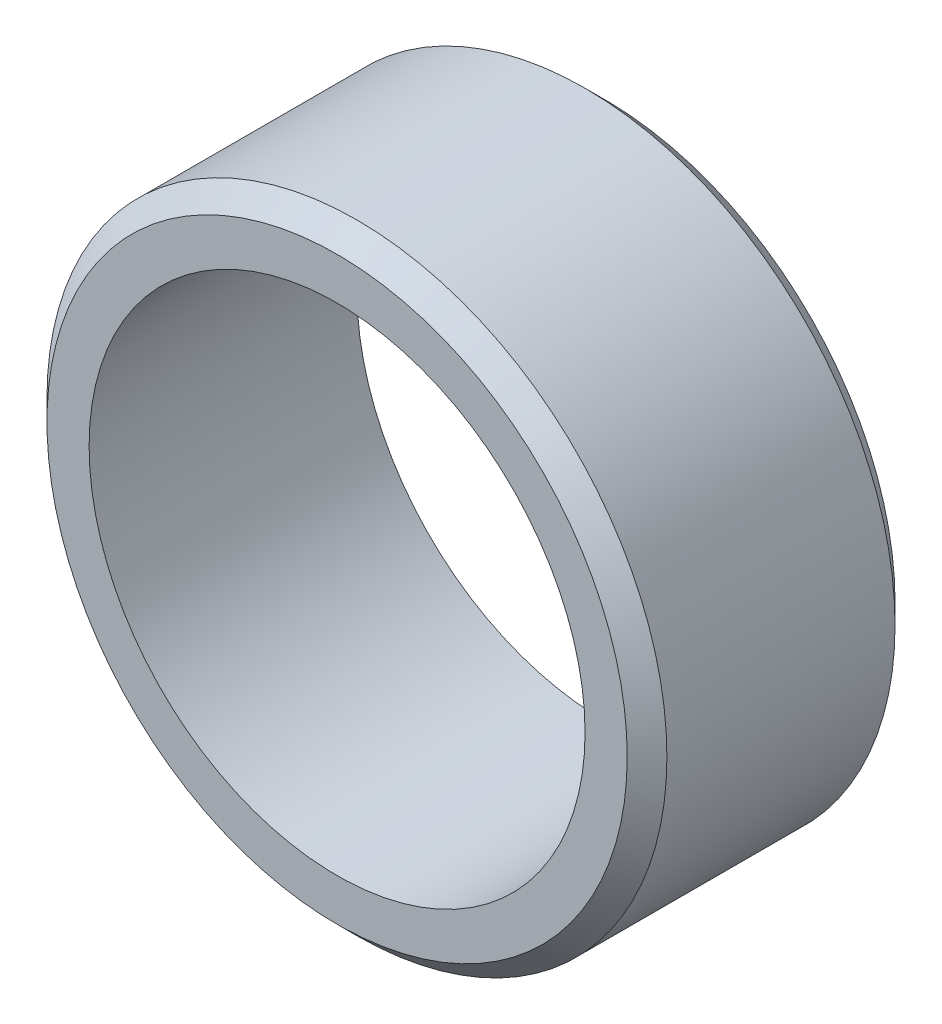
ISO-10303-21;
HEADER;
FILE_DESCRIPTION(('STEP AP214'),'2;1');
FILE_NAME('part.step','',(''),(''),'','','');
FILE_SCHEMA(('AUTOMOTIVE_DESIGN { 1 0 10303 214 1 1 1 1 }'));
ENDSEC;
DATA;
#1=APPLICATION_CONTEXT('core data for automotive mechanical design processes');
#2=APPLICATION_PROTOCOL_DEFINITION('international standard','automotive_design',2000,#1);
#3=PRODUCT_CONTEXT('',#1,'mechanical');
#4=PRODUCT('Part','Part','',(#3));
#5=PRODUCT_RELATED_PRODUCT_CATEGORY('part','',(#4));
#6=PRODUCT_DEFINITION_FORMATION('','',#4);
#7=PRODUCT_DEFINITION_CONTEXT('part definition',#1,'design');
#8=PRODUCT_DEFINITION('design','',#6,#7);
#9=PRODUCT_DEFINITION_SHAPE('','',#8);
#10=(LENGTH_UNIT() NAMED_UNIT(*) SI_UNIT(.MILLI.,.METRE.));
#11=(NAMED_UNIT(*) PLANE_ANGLE_UNIT() SI_UNIT($,.RADIAN.));
#12=(NAMED_UNIT(*) SI_UNIT($,.STERADIAN.) SOLID_ANGLE_UNIT());
#13=UNCERTAINTY_MEASURE_WITH_UNIT(LENGTH_MEASURE(1.E-05),#10,'distance_accuracy_value','');
#14=(GEOMETRIC_REPRESENTATION_CONTEXT(3) GLOBAL_UNCERTAINTY_ASSIGNED_CONTEXT((#13)) GLOBAL_UNIT_ASSIGNED_CONTEXT((#10,
#11,#12)) REPRESENTATION_CONTEXT('',''));
#15=CARTESIAN_POINT('',(0.,0.,0.));
#16=DIRECTION('',(0.,0.,1.));
#17=DIRECTION('',(1.,0.,0.));
#18=AXIS2_PLACEMENT_3D('',#15,#16,#17);
#19=CARTESIAN_POINT('',(0.,0.,6.858));
#20=DIRECTION('',(0.,0.,1.));
#21=DIRECTION('',(1.,0.,0.));
#22=AXIS2_PLACEMENT_3D('',#19,#20,#21);
#23=PLANE('',#22);
#24=CARTESIAN_POINT('',(0.,0.,6.858));
#25=DIRECTION('',(0.,0.,1.));
#26=DIRECTION('',(1.,0.,0.));
#27=AXIS2_PLACEMENT_3D('',#24,#25,#26);
#28=CIRCLE('',#27,7.42950000000001);
#29=CARTESIAN_POINT('',(7.42950000000001,0.,6.858));
#30=VERTEX_POINT('',#29);
#31=EDGE_CURVE('E10',#30,#30,#28,.T.);
#32=ORIENTED_EDGE('',*,*,#31,.T.);
#33=EDGE_LOOP('',(#32));
#34=FACE_BOUND('',#33,.T.);
#35=CARTESIAN_POINT('',(0.,0.,6.858));
#36=DIRECTION('',(0.,0.,1.));
#37=DIRECTION('',(1.,0.,0.));
#38=AXIS2_PLACEMENT_3D('',#35,#36,#37);
#39=CIRCLE('',#38,6.35);
#40=CARTESIAN_POINT('',(6.35,0.,6.858));
#41=VERTEX_POINT('',#40);
#42=EDGE_CURVE('E50',#41,#41,#39,.T.);
#43=ORIENTED_EDGE('',*,*,#42,.F.);
#44=EDGE_LOOP('',(#43));
#45=FACE_BOUND('',#44,.T.);
#46=ADVANCED_FACE('F30',(#34,#45),#23,.T.);
#47=CARTESIAN_POINT('',(0.,0.,0.));
#48=DIRECTION('',(0.,0.,1.));
#49=DIRECTION('',(1.,0.,0.));
#50=AXIS2_PLACEMENT_3D('',#47,#48,#49);
#51=PLANE('',#50);
#52=CARTESIAN_POINT('',(0.,0.,0.));
#53=DIRECTION('',(0.,0.,1.));
#54=DIRECTION('',(1.,0.,0.));
#55=AXIS2_PLACEMENT_3D('',#52,#53,#54);
#56=CIRCLE('',#55,7.4295);
#57=CARTESIAN_POINT('',(7.4295,0.,0.));
#58=VERTEX_POINT('',#57);
#59=EDGE_CURVE('E37',#58,#58,#56,.F.);
#60=ORIENTED_EDGE('',*,*,#59,.T.);
#61=EDGE_LOOP('',(#60));
#62=FACE_BOUND('',#61,.T.);
#63=CARTESIAN_POINT('',(0.,0.,0.));
#64=DIRECTION('',(0.,0.,1.));
#65=DIRECTION('',(1.,0.,0.));
#66=AXIS2_PLACEMENT_3D('',#63,#64,#65);
#67=CIRCLE('',#66,6.35);
#68=CARTESIAN_POINT('',(6.35,0.,0.));
#69=VERTEX_POINT('',#68);
#70=EDGE_CURVE('E51',#69,#69,#67,.T.);
#71=ORIENTED_EDGE('',*,*,#70,.T.);
#72=EDGE_LOOP('',(#71));
#73=FACE_BOUND('',#72,.T.);
#74=ADVANCED_FACE('F61',(#62,#73),#51,.F.);
#75=CARTESIAN_POINT('',(0.,0.,6.858));
#76=DIRECTION('',(0.,0.,-1.));
#77=DIRECTION('',(-1.,0.,0.));
#78=AXIS2_PLACEMENT_3D('',#75,#76,#77);
#79=CYLINDRICAL_SURFACE('',#78,7.9375);
#80=CARTESIAN_POINT('',(0.,0.,0.508));
#81=DIRECTION('',(0.,0.,1.));
#82=DIRECTION('',(1.,0.,0.));
#83=AXIS2_PLACEMENT_3D('',#80,#81,#82);
#84=CIRCLE('',#83,7.9375);
#85=CARTESIAN_POINT('',(7.9375,0.,0.508));
#86=VERTEX_POINT('',#85);
#87=EDGE_CURVE('E41',#86,#86,#84,.T.);
#88=ORIENTED_EDGE('',*,*,#87,.T.);
#89=EDGE_LOOP('',(#88));
#90=FACE_BOUND('',#89,.T.);
#91=CARTESIAN_POINT('',(0.,0.,6.35000000000001));
#92=DIRECTION('',(0.,0.,1.));
#93=DIRECTION('',(1.,0.,0.));
#94=AXIS2_PLACEMENT_3D('',#91,#92,#93);
#95=CIRCLE('',#94,7.9375);
#96=CARTESIAN_POINT('',(7.9375,0.,6.35000000000001));
#97=VERTEX_POINT('',#96);
#98=EDGE_CURVE('E45',#97,#97,#95,.F.);
#99=ORIENTED_EDGE('',*,*,#98,.T.);
#100=EDGE_LOOP('',(#99));
#101=FACE_BOUND('',#100,.T.);
#102=ADVANCED_FACE('F66',(#90,#101),#79,.T.);
#103=CARTESIAN_POINT('',(0.,0.,6.858));
#104=DIRECTION('',(0.,0.,-1.));
#105=DIRECTION('',(-1.,0.,0.));
#106=AXIS2_PLACEMENT_3D('',#103,#104,#105);
#107=CYLINDRICAL_SURFACE('',#106,6.35);
#108=ORIENTED_EDGE('',*,*,#42,.T.);
#109=EDGE_LOOP('',(#108));
#110=FACE_BOUND('',#109,.T.);
#111=ORIENTED_EDGE('',*,*,#70,.F.);
#112=EDGE_LOOP('',(#111));
#113=FACE_BOUND('',#112,.T.);
#114=ADVANCED_FACE('F57',(#110,#113),#107,.F.);
#115=CARTESIAN_POINT('',(0.,0.,0.508));
#116=DIRECTION('',(0.,0.,1.));
#117=DIRECTION('',(1.,0.,0.));
#118=AXIS2_PLACEMENT_3D('',#115,#116,#117);
#119=CONICAL_SURFACE('',#118,7.9375,0.785398163397452);
#120=ORIENTED_EDGE('',*,*,#59,.F.);
#121=EDGE_LOOP('',(#120));
#122=FACE_BOUND('',#121,.T.);
#123=ORIENTED_EDGE('',*,*,#87,.F.);
#124=EDGE_LOOP('',(#123));
#125=FACE_BOUND('',#124,.T.);
#126=ADVANCED_FACE('F72',(#122,#125),#119,.T.);
#127=CARTESIAN_POINT('',(0.,0.,6.858));
#128=DIRECTION('',(0.,0.,-1.));
#129=DIRECTION('',(-1.,0.,0.));
#130=AXIS2_PLACEMENT_3D('',#127,#128,#129);
#131=CONICAL_SURFACE('',#130,7.42950000000001,0.785398163397445);
#132=ORIENTED_EDGE('',*,*,#98,.F.);
#133=EDGE_LOOP('',(#132));
#134=FACE_BOUND('',#133,.T.);
#135=ORIENTED_EDGE('',*,*,#31,.F.);
#136=EDGE_LOOP('',(#135));
#137=FACE_BOUND('',#136,.T.);
#138=ADVANCED_FACE('F32',(#134,#137),#131,.T.);
#139=CLOSED_SHELL('',(#46,#74,#102,#114,#126,#138));
#140=MANIFOLD_SOLID_BREP('B2',#139);
#141=ADVANCED_BREP_SHAPE_REPRESENTATION('',(#18,#140),#14);
#142=SHAPE_DEFINITION_REPRESENTATION(#9,#141);
ENDSEC;
END-ISO-10303-21;
